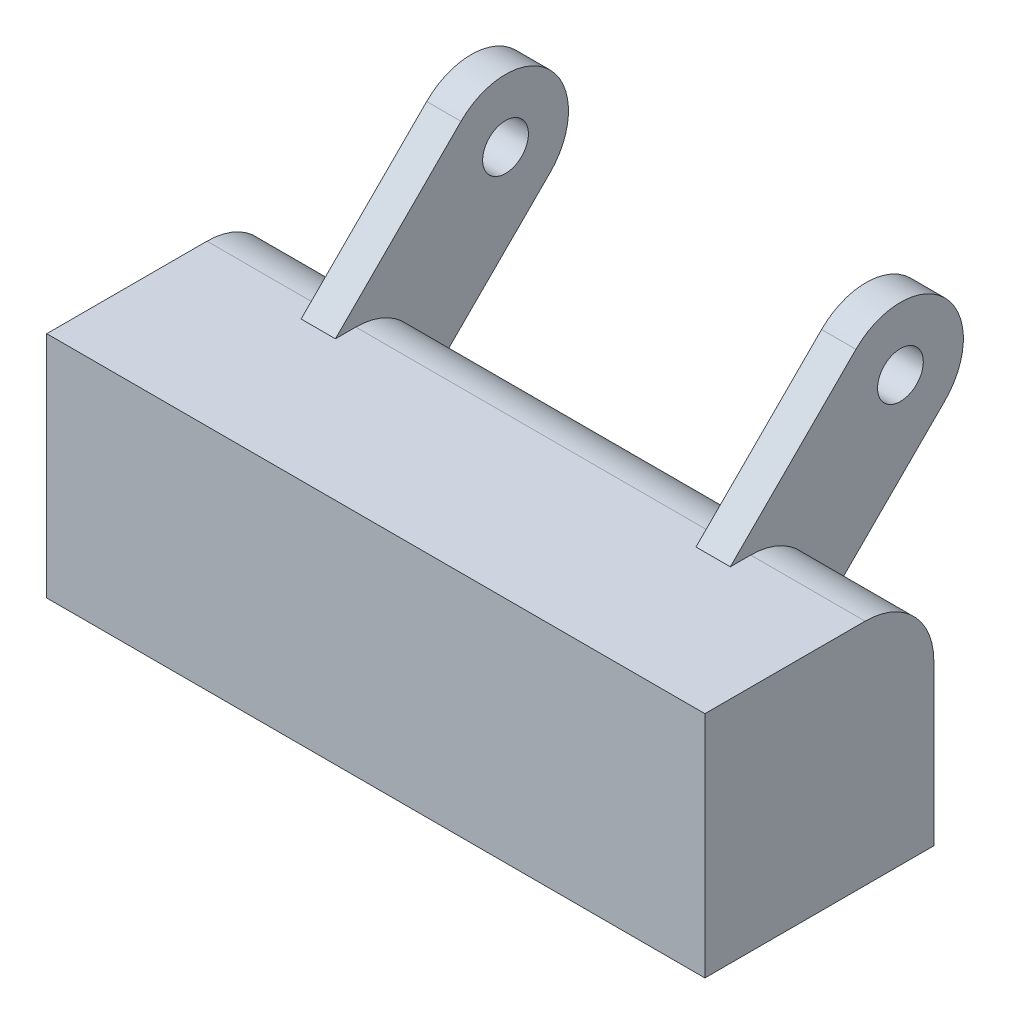
ISO-10303-21;
HEADER;
FILE_DESCRIPTION(('STEP AP214'),'2;1');
FILE_NAME('part.step','',(''),(''),'','','');
FILE_SCHEMA(('AUTOMOTIVE_DESIGN { 1 0 10303 214 1 1 1 1 }'));
ENDSEC;
DATA;
#1=APPLICATION_CONTEXT('core data for automotive mechanical design processes');
#2=APPLICATION_PROTOCOL_DEFINITION('international standard','automotive_design',2000,#1);
#3=PRODUCT_CONTEXT('',#1,'mechanical');
#4=PRODUCT('Part','Part','',(#3));
#5=PRODUCT_RELATED_PRODUCT_CATEGORY('part','',(#4));
#6=PRODUCT_DEFINITION_FORMATION('','',#4);
#7=PRODUCT_DEFINITION_CONTEXT('part definition',#1,'design');
#8=PRODUCT_DEFINITION('design','',#6,#7);
#9=PRODUCT_DEFINITION_SHAPE('','',#8);
#10=(LENGTH_UNIT() NAMED_UNIT(*) SI_UNIT(.MILLI.,.METRE.));
#11=(NAMED_UNIT(*) PLANE_ANGLE_UNIT() SI_UNIT($,.RADIAN.));
#12=(NAMED_UNIT(*) SI_UNIT($,.STERADIAN.) SOLID_ANGLE_UNIT());
#13=UNCERTAINTY_MEASURE_WITH_UNIT(LENGTH_MEASURE(1.E-05),#10,'distance_accuracy_value','');
#14=(GEOMETRIC_REPRESENTATION_CONTEXT(3) GLOBAL_UNCERTAINTY_ASSIGNED_CONTEXT((#13)) GLOBAL_UNIT_ASSIGNED_CONTEXT((#10,
#11,#12)) REPRESENTATION_CONTEXT('',''));
#15=CARTESIAN_POINT('',(0.,0.,0.));
#16=DIRECTION('',(0.,0.,1.));
#17=DIRECTION('',(1.,0.,0.));
#18=AXIS2_PLACEMENT_3D('',#15,#16,#17);
#19=CARTESIAN_POINT('',(28.75,-6.,6.));
#20=DIRECTION('',(-1.,0.,0.));
#21=DIRECTION('',(0.,0.,1.));
#22=AXIS2_PLACEMENT_3D('',#19,#20,#21);
#23=CYLINDRICAL_SURFACE('',#22,6.);
#24=CARTESIAN_POINT('',(-18.75,-6.,6.));
#25=DIRECTION('',(1.,0.,0.));
#26=DIRECTION('',(0.,0.,-1.));
#27=AXIS2_PLACEMENT_3D('',#24,#25,#26);
#28=CIRCLE('',#27,6.);
#29=CARTESIAN_POINT('',(-18.75,-6.00000000000004,0.));
#30=VERTEX_POINT('',#29);
#31=CARTESIAN_POINT('',(-18.75,0.,6.00000000000004));
#32=VERTEX_POINT('',#31);
#33=EDGE_CURVE('E164',#30,#32,#28,.T.);
#34=ORIENTED_EDGE('',*,*,#33,.F.);
#35=DIRECTION('',(-1.,0.,0.));
#36=VECTOR('',#35,1.);
#37=CARTESIAN_POINT('',(28.75,-6.00000000000004,0.));
#38=LINE('',#37,#36);
#39=CARTESIAN_POINT('',(-28.75,-6.00000000000004,0.));
#40=VERTEX_POINT('',#39);
#41=EDGE_CURVE('E269',#30,#40,#38,.T.);
#42=ORIENTED_EDGE('',*,*,#41,.T.);
#43=CARTESIAN_POINT('',(-28.75,-6.,6.));
#44=DIRECTION('',(1.,0.,0.));
#45=DIRECTION('',(0.,0.,-1.));
#46=AXIS2_PLACEMENT_3D('',#43,#44,#45);
#47=CIRCLE('',#46,6.);
#48=CARTESIAN_POINT('',(-28.75,0.,6.00000000000004));
#49=VERTEX_POINT('',#48);
#50=EDGE_CURVE('E259',#40,#49,#47,.T.);
#51=ORIENTED_EDGE('',*,*,#50,.T.);
#52=DIRECTION('',(-1.,0.,0.));
#53=VECTOR('',#52,1.);
#54=CARTESIAN_POINT('',(28.75,0.,6.00000000000004));
#55=LINE('',#54,#53);
#56=EDGE_CURVE('E265',#32,#49,#55,.T.);
#57=ORIENTED_EDGE('',*,*,#56,.F.);
#58=EDGE_LOOP('',(#34,#42,#51,#57));
#59=FACE_BOUND('',#58,.T.);
#60=ADVANCED_FACE('F39',(#59),#23,.T.);
#61=CARTESIAN_POINT('',(28.75,-6.00000000000004,0.));
#62=DIRECTION('',(0.,0.,1.));
#63=DIRECTION('',(0.,-1.,0.));
#64=AXIS2_PLACEMENT_3D('',#61,#62,#63);
#65=PLANE('',#64);
#66=DIRECTION('',(1.,0.,0.));
#67=VECTOR('',#66,1.);
#68=CARTESIAN_POINT('',(28.75,-7.77817459305203,0.));
#69=LINE('',#68,#67);
#70=CARTESIAN_POINT('',(-18.75,-7.77817459305203,0.));
#71=VERTEX_POINT('',#70);
#72=CARTESIAN_POINT('',(-15.75,-7.77817459305203,0.));
#73=VERTEX_POINT('',#72);
#74=EDGE_CURVE('E11',#71,#73,#69,.T.);
#75=ORIENTED_EDGE('',*,*,#74,.T.);
#76=DIRECTION('',(0.,1.,0.));
#77=VECTOR('',#76,1.);
#78=CARTESIAN_POINT('',(-15.75,-6.00000000000004,0.));
#79=LINE('',#78,#77);
#80=CARTESIAN_POINT('',(-15.75,-6.00000000000004,0.));
#81=VERTEX_POINT('',#80);
#82=EDGE_CURVE('E178',#73,#81,#79,.T.);
#83=ORIENTED_EDGE('',*,*,#82,.T.);
#84=CARTESIAN_POINT('',(15.75,-6.,0.));
#85=VERTEX_POINT('',#84);
#86=EDGE_CURVE('E275',#85,#81,#38,.T.);
#87=ORIENTED_EDGE('',*,*,#86,.F.);
#88=DIRECTION('',(0.,1.,0.));
#89=VECTOR('',#88,1.);
#90=CARTESIAN_POINT('',(15.75,-6.00000000000004,0.));
#91=LINE('',#90,#89);
#92=CARTESIAN_POINT('',(15.75,-7.77817459305203,0.));
#93=VERTEX_POINT('',#92);
#94=EDGE_CURVE('E236',#93,#85,#91,.T.);
#95=ORIENTED_EDGE('',*,*,#94,.F.);
#96=DIRECTION('',(-1.,0.,0.));
#97=VECTOR('',#96,1.);
#98=CARTESIAN_POINT('',(28.75,-7.77817459305203,0.));
#99=LINE('',#98,#97);
#100=CARTESIAN_POINT('',(18.75,-7.77817459305203,0.));
#101=VERTEX_POINT('',#100);
#102=EDGE_CURVE('E289',#101,#93,#99,.T.);
#103=ORIENTED_EDGE('',*,*,#102,.F.);
#104=DIRECTION('',(0.,1.,0.));
#105=VECTOR('',#104,1.);
#106=CARTESIAN_POINT('',(18.75,-6.00000000000004,0.));
#107=LINE('',#106,#105);
#108=CARTESIAN_POINT('',(18.75,-6.,0.));
#109=VERTEX_POINT('',#108);
#110=EDGE_CURVE('E231',#101,#109,#107,.T.);
#111=ORIENTED_EDGE('',*,*,#110,.T.);
#112=CARTESIAN_POINT('',(28.75,-6.00000000000004,0.));
#113=VERTEX_POINT('',#112);
#114=EDGE_CURVE('E271',#113,#109,#38,.T.);
#115=ORIENTED_EDGE('',*,*,#114,.F.);
#116=DIRECTION('',(0.,1.,0.));
#117=VECTOR('',#116,1.);
#118=CARTESIAN_POINT('',(28.75,-6.00000000000004,0.));
#119=LINE('',#118,#117);
#120=CARTESIAN_POINT('',(28.75,-20.,0.));
#121=VERTEX_POINT('',#120);
#122=EDGE_CURVE('E245',#121,#113,#119,.T.);
#123=ORIENTED_EDGE('',*,*,#122,.F.);
#124=DIRECTION('',(-1.,0.,0.));
#125=VECTOR('',#124,1.);
#126=CARTESIAN_POINT('',(28.75,-20.,0.));
#127=LINE('',#126,#125);
#128=CARTESIAN_POINT('',(-28.75,-20.,0.));
#129=VERTEX_POINT('',#128);
#130=EDGE_CURVE('E274',#121,#129,#127,.T.);
#131=ORIENTED_EDGE('',*,*,#130,.T.);
#132=DIRECTION('',(0.,1.,0.));
#133=VECTOR('',#132,1.);
#134=CARTESIAN_POINT('',(-28.75,-6.00000000000004,0.));
#135=LINE('',#134,#133);
#136=EDGE_CURVE('E256',#129,#40,#135,.T.);
#137=ORIENTED_EDGE('',*,*,#136,.T.);
#138=ORIENTED_EDGE('',*,*,#41,.F.);
#139=DIRECTION('',(0.,1.,0.));
#140=VECTOR('',#139,1.);
#141=CARTESIAN_POINT('',(-18.75,-6.00000000000004,0.));
#142=LINE('',#141,#140);
#143=EDGE_CURVE('E57',#71,#30,#142,.T.);
#144=ORIENTED_EDGE('',*,*,#143,.F.);
#145=EDGE_LOOP('',(#75,#83,#87,#95,#103,#111,#115,#123,#131,#137,#138,#144));
#146=FACE_BOUND('',#145,.T.);
#147=ADVANCED_FACE('F332',(#146),#65,.F.);
#148=ORIENTED_EDGE('',*,*,#86,.T.);
#149=CARTESIAN_POINT('',(-15.75,-6.,6.));
#150=DIRECTION('',(1.,0.,0.));
#151=DIRECTION('',(0.,0.,-1.));
#152=AXIS2_PLACEMENT_3D('',#149,#150,#151);
#153=CIRCLE('',#152,6.);
#154=CARTESIAN_POINT('',(-15.75,0.,6.00000000000004));
#155=VERTEX_POINT('',#154);
#156=EDGE_CURVE('E198',#81,#155,#153,.T.);
#157=ORIENTED_EDGE('',*,*,#156,.T.);
#158=CARTESIAN_POINT('',(15.75,0.,6.00000000000004));
#159=VERTEX_POINT('',#158);
#160=EDGE_CURVE('E270',#159,#155,#55,.T.);
#161=ORIENTED_EDGE('',*,*,#160,.F.);
#162=CARTESIAN_POINT('',(15.75,-6.,6.));
#163=DIRECTION('',(1.,0.,0.));
#164=DIRECTION('',(0.,0.,-1.));
#165=AXIS2_PLACEMENT_3D('',#162,#163,#164);
#166=CIRCLE('',#165,6.);
#167=EDGE_CURVE('E234',#85,#159,#166,.T.);
#168=ORIENTED_EDGE('',*,*,#167,.F.);
#169=EDGE_LOOP('',(#148,#157,#161,#168));
#170=FACE_BOUND('',#169,.T.);
#171=ADVANCED_FACE('F353',(#170),#23,.T.);
#172=CARTESIAN_POINT('',(28.75,0.,6.00000000000004));
#173=DIRECTION('',(0.,-1.,0.));
#174=DIRECTION('',(0.,0.,-1.));
#175=AXIS2_PLACEMENT_3D('',#172,#173,#174);
#176=PLANE('',#175);
#177=ORIENTED_EDGE('',*,*,#160,.T.);
#178=DIRECTION('',(0.,0.,1.));
#179=VECTOR('',#178,1.);
#180=CARTESIAN_POINT('',(-15.75,0.,6.00000000000004));
#181=LINE('',#180,#179);
#182=CARTESIAN_POINT('',(-15.75,0.,7.77817459305202));
#183=VERTEX_POINT('',#182);
#184=EDGE_CURVE('E47',#155,#183,#181,.T.);
#185=ORIENTED_EDGE('',*,*,#184,.T.);
#186=DIRECTION('',(1.,0.,0.));
#187=VECTOR('',#186,1.);
#188=CARTESIAN_POINT('',(28.75,0.,7.77817459305202));
#189=LINE('',#188,#187);
#190=CARTESIAN_POINT('',(-18.75,0.,7.77817459305202));
#191=VERTEX_POINT('',#190);
#192=EDGE_CURVE('E294',#191,#183,#189,.T.);
#193=ORIENTED_EDGE('',*,*,#192,.F.);
#194=DIRECTION('',(0.,0.,1.));
#195=VECTOR('',#194,1.);
#196=CARTESIAN_POINT('',(-18.75,0.,6.00000000000004));
#197=LINE('',#196,#195);
#198=EDGE_CURVE('E291',#32,#191,#197,.T.);
#199=ORIENTED_EDGE('',*,*,#198,.F.);
#200=ORIENTED_EDGE('',*,*,#56,.T.);
#201=DIRECTION('',(0.,0.,1.));
#202=VECTOR('',#201,1.);
#203=CARTESIAN_POINT('',(-28.75,0.,6.00000000000004));
#204=LINE('',#203,#202);
#205=CARTESIAN_POINT('',(-28.75,0.,20.));
#206=VERTEX_POINT('',#205);
#207=EDGE_CURVE('E243',#49,#206,#204,.T.);
#208=ORIENTED_EDGE('',*,*,#207,.T.);
#209=DIRECTION('',(-1.,0.,0.));
#210=VECTOR('',#209,1.);
#211=CARTESIAN_POINT('',(28.75,0.,20.));
#212=LINE('',#211,#210);
#213=CARTESIAN_POINT('',(28.75,0.,20.));
#214=VERTEX_POINT('',#213);
#215=EDGE_CURVE('E251',#214,#206,#212,.T.);
#216=ORIENTED_EDGE('',*,*,#215,.F.);
#217=DIRECTION('',(0.,0.,1.));
#218=VECTOR('',#217,1.);
#219=CARTESIAN_POINT('',(28.75,0.,6.00000000000004));
#220=LINE('',#219,#218);
#221=CARTESIAN_POINT('',(28.75,0.,6.00000000000004));
#222=VERTEX_POINT('',#221);
#223=EDGE_CURVE('E249',#222,#214,#220,.T.);
#224=ORIENTED_EDGE('',*,*,#223,.F.);
#225=CARTESIAN_POINT('',(18.75,0.,6.00000000000004));
#226=VERTEX_POINT('',#225);
#227=EDGE_CURVE('E266',#222,#226,#55,.T.);
#228=ORIENTED_EDGE('',*,*,#227,.T.);
#229=DIRECTION('',(0.,0.,1.));
#230=VECTOR('',#229,1.);
#231=CARTESIAN_POINT('',(18.75,0.,6.00000000000004));
#232=LINE('',#231,#230);
#233=CARTESIAN_POINT('',(18.75,0.,7.77817459305202));
#234=VERTEX_POINT('',#233);
#235=EDGE_CURVE('E281',#226,#234,#232,.T.);
#236=ORIENTED_EDGE('',*,*,#235,.T.);
#237=DIRECTION('',(-1.,0.,0.));
#238=VECTOR('',#237,1.);
#239=CARTESIAN_POINT('',(28.75,0.,7.77817459305202));
#240=LINE('',#239,#238);
#241=CARTESIAN_POINT('',(15.75,0.,7.77817459305202));
#242=VERTEX_POINT('',#241);
#243=EDGE_CURVE('E284',#234,#242,#240,.T.);
#244=ORIENTED_EDGE('',*,*,#243,.T.);
#245=DIRECTION('',(0.,0.,1.));
#246=VECTOR('',#245,1.);
#247=CARTESIAN_POINT('',(15.75,0.,6.00000000000004));
#248=LINE('',#247,#246);
#249=EDGE_CURVE('E287',#159,#242,#248,.T.);
#250=ORIENTED_EDGE('',*,*,#249,.F.);
#251=EDGE_LOOP('',(#177,#185,#193,#199,#200,#208,#216,#224,#228,#236,#244,#250));
#252=FACE_BOUND('',#251,.T.);
#253=ADVANCED_FACE('F299',(#252),#176,.F.);
#254=CARTESIAN_POINT('',(28.75,0.,20.));
#255=DIRECTION('',(0.,0.,-1.));
#256=DIRECTION('',(0.,1.,0.));
#257=AXIS2_PLACEMENT_3D('',#254,#255,#256);
#258=PLANE('',#257);
#259=DIRECTION('',(0.,-1.,0.));
#260=VECTOR('',#259,1.);
#261=CARTESIAN_POINT('',(-28.75,0.,20.));
#262=LINE('',#261,#260);
#263=CARTESIAN_POINT('',(-28.75,-20.,20.));
#264=VERTEX_POINT('',#263);
#265=EDGE_CURVE('E238',#206,#264,#262,.T.);
#266=ORIENTED_EDGE('',*,*,#265,.T.);
#267=DIRECTION('',(-1.,0.,0.));
#268=VECTOR('',#267,1.);
#269=CARTESIAN_POINT('',(28.75,-20.,20.));
#270=LINE('',#269,#268);
#271=CARTESIAN_POINT('',(28.75,-20.,20.));
#272=VERTEX_POINT('',#271);
#273=EDGE_CURVE('E278',#272,#264,#270,.T.);
#274=ORIENTED_EDGE('',*,*,#273,.F.);
#275=DIRECTION('',(0.,-1.,0.));
#276=VECTOR('',#275,1.);
#277=CARTESIAN_POINT('',(28.75,0.,20.));
#278=LINE('',#277,#276);
#279=EDGE_CURVE('E239',#214,#272,#278,.T.);
#280=ORIENTED_EDGE('',*,*,#279,.F.);
#281=ORIENTED_EDGE('',*,*,#215,.T.);
#282=EDGE_LOOP('',(#266,#274,#280,#281));
#283=FACE_BOUND('',#282,.T.);
#284=ADVANCED_FACE('F41',(#283),#258,.F.);
#285=CARTESIAN_POINT('',(28.75,-20.,0.));
#286=DIRECTION('',(0.,1.,0.));
#287=DIRECTION('',(0.,0.,1.));
#288=AXIS2_PLACEMENT_3D('',#285,#286,#287);
#289=PLANE('',#288);
#290=DIRECTION('',(0.,0.,-1.));
#291=VECTOR('',#290,1.);
#292=CARTESIAN_POINT('',(-28.75,-20.,0.));
#293=LINE('',#292,#291);
#294=EDGE_CURVE('E254',#264,#129,#293,.T.);
#295=ORIENTED_EDGE('',*,*,#294,.T.);
#296=ORIENTED_EDGE('',*,*,#130,.F.);
#297=DIRECTION('',(0.,0.,-1.));
#298=VECTOR('',#297,1.);
#299=CARTESIAN_POINT('',(28.75,-20.,0.));
#300=LINE('',#299,#298);
#301=EDGE_CURVE('E242',#272,#121,#300,.T.);
#302=ORIENTED_EDGE('',*,*,#301,.F.);
#303=ORIENTED_EDGE('',*,*,#273,.T.);
#304=EDGE_LOOP('',(#295,#296,#302,#303));
#305=FACE_BOUND('',#304,.T.);
#306=ADVANCED_FACE('F363',(#305),#289,.F.);
#307=ORIENTED_EDGE('',*,*,#114,.T.);
#308=CARTESIAN_POINT('',(18.75,-6.,6.));
#309=DIRECTION('',(1.,0.,0.));
#310=DIRECTION('',(0.,0.,-1.));
#311=AXIS2_PLACEMENT_3D('',#308,#309,#310);
#312=CIRCLE('',#311,6.);
#313=EDGE_CURVE('E227',#109,#226,#312,.T.);
#314=ORIENTED_EDGE('',*,*,#313,.T.);
#315=ORIENTED_EDGE('',*,*,#227,.F.);
#316=CARTESIAN_POINT('',(28.75,-6.,6.));
#317=DIRECTION('',(1.,0.,0.));
#318=DIRECTION('',(0.,0.,-1.));
#319=AXIS2_PLACEMENT_3D('',#316,#317,#318);
#320=CIRCLE('',#319,6.);
#321=EDGE_CURVE('E247',#113,#222,#320,.T.);
#322=ORIENTED_EDGE('',*,*,#321,.F.);
#323=EDGE_LOOP('',(#307,#314,#315,#322));
#324=FACE_BOUND('',#323,.T.);
#325=ADVANCED_FACE('F326',(#324),#23,.T.);
#326=CARTESIAN_POINT('',(28.75,-6.,6.));
#327=DIRECTION('',(1.,0.,0.));
#328=DIRECTION('',(0.,0.,-1.));
#329=AXIS2_PLACEMENT_3D('',#326,#327,#328);
#330=PLANE('',#329);
#331=ORIENTED_EDGE('',*,*,#279,.T.);
#332=ORIENTED_EDGE('',*,*,#301,.T.);
#333=ORIENTED_EDGE('',*,*,#122,.T.);
#334=ORIENTED_EDGE('',*,*,#321,.T.);
#335=ORIENTED_EDGE('',*,*,#223,.T.);
#336=EDGE_LOOP('',(#331,#332,#333,#334,#335));
#337=FACE_BOUND('',#336,.T.);
#338=ADVANCED_FACE('F321',(#337),#330,.T.);
#339=CARTESIAN_POINT('',(-28.75,-6.,6.));
#340=DIRECTION('',(1.,0.,0.));
#341=DIRECTION('',(0.,0.,-1.));
#342=AXIS2_PLACEMENT_3D('',#339,#340,#341);
#343=PLANE('',#342);
#344=ORIENTED_EDGE('',*,*,#265,.F.);
#345=ORIENTED_EDGE('',*,*,#207,.F.);
#346=ORIENTED_EDGE('',*,*,#50,.F.);
#347=ORIENTED_EDGE('',*,*,#136,.F.);
#348=ORIENTED_EDGE('',*,*,#294,.F.);
#349=EDGE_LOOP('',(#344,#345,#346,#347,#348));
#350=FACE_BOUND('',#349,.T.);
#351=ADVANCED_FACE('F314',(#350),#343,.F.);
#352=CARTESIAN_POINT('',(15.75,-3.88908729652601,-3.88908729652601));
#353=DIRECTION('',(0.,0.707106781186547,0.707106781186548));
#354=DIRECTION('',(0.,-0.707106781186548,0.707106781186547));
#355=AXIS2_PLACEMENT_3D('',#352,#353,#354);
#356=PLANE('',#355);
#357=DIRECTION('',(0.,-0.707106781186548,0.707106781186547));
#358=VECTOR('',#357,1.);
#359=CARTESIAN_POINT('',(18.75,-3.88908729652601,-3.88908729652601));
#360=LINE('',#359,#358);
#361=CARTESIAN_POINT('',(18.75,3.19238815542511,-10.9705627484771));
#362=VERTEX_POINT('',#361);
#363=EDGE_CURVE('E201',#362,#101,#360,.T.);
#364=ORIENTED_EDGE('',*,*,#363,.T.);
#365=ORIENTED_EDGE('',*,*,#102,.T.);
#366=DIRECTION('',(0.,-0.707106781186548,0.707106781186547));
#367=VECTOR('',#366,1.);
#368=CARTESIAN_POINT('',(15.75,-3.88908729652601,-3.88908729652601));
#369=LINE('',#368,#367);
#370=CARTESIAN_POINT('',(15.75,3.19238815542511,-10.9705627484771));
#371=VERTEX_POINT('',#370);
#372=EDGE_CURVE('E202',#371,#93,#369,.T.);
#373=ORIENTED_EDGE('',*,*,#372,.F.);
#374=DIRECTION('',(1.,0.,0.));
#375=VECTOR('',#374,1.);
#376=CARTESIAN_POINT('',(15.75,3.19238815542511,-10.9705627484771));
#377=LINE('',#376,#375);
#378=EDGE_CURVE('E215',#371,#362,#377,.T.);
#379=ORIENTED_EDGE('',*,*,#378,.T.);
#380=EDGE_LOOP('',(#364,#365,#373,#379));
#381=FACE_BOUND('',#380,.T.);
#382=ADVANCED_FACE('F338',(#381),#356,.F.);
#383=CARTESIAN_POINT('',(15.75,3.88908729652601,3.88908729652601));
#384=DIRECTION('',(0.,0.707106781186547,0.707106781186548));
#385=DIRECTION('',(0.,-0.707106781186548,0.707106781186547));
#386=AXIS2_PLACEMENT_3D('',#383,#384,#385);
#387=PLANE('',#386);
#388=ORIENTED_EDGE('',*,*,#243,.F.);
#389=DIRECTION('',(0.,-0.707106781186548,0.707106781186547));
#390=VECTOR('',#389,1.);
#391=CARTESIAN_POINT('',(18.75,3.88908729652601,3.88908729652601));
#392=LINE('',#391,#390);
#393=CARTESIAN_POINT('',(18.75,10.9705627484771,-3.19238815542512));
#394=VERTEX_POINT('',#393);
#395=EDGE_CURVE('E221',#394,#234,#392,.T.);
#396=ORIENTED_EDGE('',*,*,#395,.F.);
#397=DIRECTION('',(1.,0.,0.));
#398=VECTOR('',#397,1.);
#399=CARTESIAN_POINT('',(15.75,10.9705627484771,-3.19238815542512));
#400=LINE('',#399,#398);
#401=CARTESIAN_POINT('',(15.75,10.9705627484771,-3.19238815542512));
#402=VERTEX_POINT('',#401);
#403=EDGE_CURVE('E225',#402,#394,#400,.T.);
#404=ORIENTED_EDGE('',*,*,#403,.F.);
#405=DIRECTION('',(0.,-0.707106781186548,0.707106781186547));
#406=VECTOR('',#405,1.);
#407=CARTESIAN_POINT('',(15.75,3.88908729652601,3.88908729652601));
#408=LINE('',#407,#406);
#409=EDGE_CURVE('E209',#402,#242,#408,.T.);
#410=ORIENTED_EDGE('',*,*,#409,.T.);
#411=EDGE_LOOP('',(#388,#396,#404,#410));
#412=FACE_BOUND('',#411,.T.);
#413=ADVANCED_FACE('F350',(#412),#387,.T.);
#414=CARTESIAN_POINT('',(15.75,0.,0.));
#415=DIRECTION('',(1.,0.,0.));
#416=DIRECTION('',(0.,0.,-1.));
#417=AXIS2_PLACEMENT_3D('',#414,#415,#416);
#418=PLANE('',#417);
#419=CARTESIAN_POINT('',(15.75,7.08147545195112,-7.08147545195113));
#420=DIRECTION('',(1.,0.,0.));
#421=DIRECTION('',(0.,0.,-1.));
#422=AXIS2_PLACEMENT_3D('',#419,#420,#421);
#423=CIRCLE('',#422,2.);
#424=CARTESIAN_POINT('',(15.75,7.08147545195112,-9.08147545195113));
#425=VERTEX_POINT('',#424);
#426=EDGE_CURVE('E212',#425,#425,#423,.T.);
#427=ORIENTED_EDGE('',*,*,#426,.T.);
#428=EDGE_LOOP('',(#427));
#429=FACE_BOUND('',#428,.T.);
#430=ORIENTED_EDGE('',*,*,#372,.T.);
#431=ORIENTED_EDGE('',*,*,#94,.T.);
#432=ORIENTED_EDGE('',*,*,#167,.T.);
#433=ORIENTED_EDGE('',*,*,#249,.T.);
#434=ORIENTED_EDGE('',*,*,#409,.F.);
#435=CARTESIAN_POINT('',(15.75,7.08147545195112,-7.08147545195113));
#436=DIRECTION('',(1.,0.,0.));
#437=DIRECTION('',(0.,0.,-1.));
#438=AXIS2_PLACEMENT_3D('',#435,#436,#437);
#439=CIRCLE('',#438,5.5);
#440=EDGE_CURVE('E205',#371,#402,#439,.T.);
#441=ORIENTED_EDGE('',*,*,#440,.F.);
#442=EDGE_LOOP('',(#430,#431,#432,#433,#434,#441));
#443=FACE_BOUND('',#442,.T.);
#444=ADVANCED_FACE('F341',(#429,#443),#418,.F.);
#445=CARTESIAN_POINT('',(18.75,0.,0.));
#446=DIRECTION('',(1.,0.,0.));
#447=DIRECTION('',(0.,0.,-1.));
#448=AXIS2_PLACEMENT_3D('',#445,#446,#447);
#449=PLANE('',#448);
#450=CARTESIAN_POINT('',(18.75,7.08147545195112,-7.08147545195113));
#451=DIRECTION('',(1.,0.,0.));
#452=DIRECTION('',(0.,0.,-1.));
#453=AXIS2_PLACEMENT_3D('',#450,#451,#452);
#454=CIRCLE('',#453,2.);
#455=CARTESIAN_POINT('',(18.75,7.08147545195112,-9.08147545195113));
#456=VERTEX_POINT('',#455);
#457=EDGE_CURVE('E206',#456,#456,#454,.T.);
#458=ORIENTED_EDGE('',*,*,#457,.F.);
#459=EDGE_LOOP('',(#458));
#460=FACE_BOUND('',#459,.T.);
#461=ORIENTED_EDGE('',*,*,#110,.F.);
#462=ORIENTED_EDGE('',*,*,#363,.F.);
#463=CARTESIAN_POINT('',(18.75,7.08147545195112,-7.08147545195113));
#464=DIRECTION('',(1.,0.,0.));
#465=DIRECTION('',(0.,0.,-1.));
#466=AXIS2_PLACEMENT_3D('',#463,#464,#465);
#467=CIRCLE('',#466,5.5);
#468=EDGE_CURVE('E218',#362,#394,#467,.T.);
#469=ORIENTED_EDGE('',*,*,#468,.T.);
#470=ORIENTED_EDGE('',*,*,#395,.T.);
#471=ORIENTED_EDGE('',*,*,#235,.F.);
#472=ORIENTED_EDGE('',*,*,#313,.F.);
#473=EDGE_LOOP('',(#461,#462,#469,#470,#471,#472));
#474=FACE_BOUND('',#473,.T.);
#475=ADVANCED_FACE('F329',(#460,#474),#449,.T.);
#476=CARTESIAN_POINT('',(15.75,7.08147545195112,-7.08147545195113));
#477=DIRECTION('',(1.,0.,0.));
#478=DIRECTION('',(0.,0.,-1.));
#479=AXIS2_PLACEMENT_3D('',#476,#477,#478);
#480=CYLINDRICAL_SURFACE('',#479,5.5);
#481=ORIENTED_EDGE('',*,*,#468,.F.);
#482=ORIENTED_EDGE('',*,*,#378,.F.);
#483=ORIENTED_EDGE('',*,*,#440,.T.);
#484=ORIENTED_EDGE('',*,*,#403,.T.);
#485=EDGE_LOOP('',(#481,#482,#483,#484));
#486=FACE_BOUND('',#485,.T.);
#487=ADVANCED_FACE('F346',(#486),#480,.T.);
#488=CARTESIAN_POINT('',(15.75,7.08147545195112,-7.08147545195113));
#489=DIRECTION('',(1.,0.,0.));
#490=DIRECTION('',(0.,0.,-1.));
#491=AXIS2_PLACEMENT_3D('',#488,#489,#490);
#492=CYLINDRICAL_SURFACE('',#491,2.);
#493=ORIENTED_EDGE('',*,*,#426,.F.);
#494=EDGE_LOOP('',(#493));
#495=FACE_BOUND('',#494,.T.);
#496=ORIENTED_EDGE('',*,*,#457,.T.);
#497=EDGE_LOOP('',(#496));
#498=FACE_BOUND('',#497,.T.);
#499=ADVANCED_FACE('F394',(#495,#498),#492,.F.);
#500=CARTESIAN_POINT('',(-15.75,-3.88908729652601,-3.88908729652601));
#501=DIRECTION('',(0.,-0.707106781186547,-0.707106781186548));
#502=DIRECTION('',(0.,0.707106781186548,-0.707106781186547));
#503=AXIS2_PLACEMENT_3D('',#500,#501,#502);
#504=PLANE('',#503);
#505=ORIENTED_EDGE('',*,*,#74,.F.);
#506=DIRECTION('',(0.,-0.707106781186548,0.707106781186547));
#507=VECTOR('',#506,1.);
#508=CARTESIAN_POINT('',(-18.75,-3.88908729652601,-3.88908729652601));
#509=LINE('',#508,#507);
#510=CARTESIAN_POINT('',(-18.75,3.19238815542511,-10.9705627484771));
#511=VERTEX_POINT('',#510);
#512=EDGE_CURVE('E161',#511,#71,#509,.T.);
#513=ORIENTED_EDGE('',*,*,#512,.F.);
#514=DIRECTION('',(-1.,0.,0.));
#515=VECTOR('',#514,1.);
#516=CARTESIAN_POINT('',(-15.75,3.19238815542511,-10.9705627484771));
#517=LINE('',#516,#515);
#518=CARTESIAN_POINT('',(-15.75,3.19238815542511,-10.9705627484771));
#519=VERTEX_POINT('',#518);
#520=EDGE_CURVE('E155',#519,#511,#517,.T.);
#521=ORIENTED_EDGE('',*,*,#520,.F.);
#522=DIRECTION('',(0.,-0.707106781186548,0.707106781186547));
#523=VECTOR('',#522,1.);
#524=CARTESIAN_POINT('',(-15.75,-3.88908729652601,-3.88908729652601));
#525=LINE('',#524,#523);
#526=EDGE_CURVE('E159',#519,#73,#525,.T.);
#527=ORIENTED_EDGE('',*,*,#526,.T.);
#528=EDGE_LOOP('',(#505,#513,#521,#527));
#529=FACE_BOUND('',#528,.T.);
#530=ADVANCED_FACE('F157',(#529),#504,.T.);
#531=CARTESIAN_POINT('',(-15.75,3.88908729652601,3.88908729652601));
#532=DIRECTION('',(0.,-0.707106781186547,-0.707106781186548));
#533=DIRECTION('',(0.,0.707106781186548,-0.707106781186547));
#534=AXIS2_PLACEMENT_3D('',#531,#532,#533);
#535=PLANE('',#534);
#536=DIRECTION('',(0.,-0.707106781186548,0.707106781186547));
#537=VECTOR('',#536,1.);
#538=CARTESIAN_POINT('',(-18.75,3.88908729652601,3.88908729652601));
#539=LINE('',#538,#537);
#540=CARTESIAN_POINT('',(-18.75,10.9705627484771,-3.19238815542512));
#541=VERTEX_POINT('',#540);
#542=EDGE_CURVE('E182',#541,#191,#539,.T.);
#543=ORIENTED_EDGE('',*,*,#542,.T.);
#544=ORIENTED_EDGE('',*,*,#192,.T.);
#545=DIRECTION('',(0.,-0.707106781186548,0.707106781186547));
#546=VECTOR('',#545,1.);
#547=CARTESIAN_POINT('',(-15.75,3.88908729652601,3.88908729652601));
#548=LINE('',#547,#546);
#549=CARTESIAN_POINT('',(-15.75,10.9705627484771,-3.19238815542512));
#550=VERTEX_POINT('',#549);
#551=EDGE_CURVE('E174',#550,#183,#548,.T.);
#552=ORIENTED_EDGE('',*,*,#551,.F.);
#553=DIRECTION('',(-1.,0.,0.));
#554=VECTOR('',#553,1.);
#555=CARTESIAN_POINT('',(-15.75,10.9705627484771,-3.19238815542512));
#556=LINE('',#555,#554);
#557=EDGE_CURVE('E165',#550,#541,#556,.T.);
#558=ORIENTED_EDGE('',*,*,#557,.T.);
#559=EDGE_LOOP('',(#543,#544,#552,#558));
#560=FACE_BOUND('',#559,.T.);
#561=ADVANCED_FACE('F303',(#560),#535,.F.);
#562=CARTESIAN_POINT('',(-15.75,0.,0.));
#563=DIRECTION('',(1.,0.,0.));
#564=DIRECTION('',(0.,0.,-1.));
#565=AXIS2_PLACEMENT_3D('',#562,#563,#564);
#566=PLANE('',#565);
#567=CARTESIAN_POINT('',(-15.75,7.08147545195112,-7.08147545195113));
#568=DIRECTION('',(1.,0.,0.));
#569=DIRECTION('',(0.,0.,-1.));
#570=AXIS2_PLACEMENT_3D('',#567,#568,#569);
#571=CIRCLE('',#570,2.);
#572=CARTESIAN_POINT('',(-15.75,7.08147545195112,-9.08147545195113));
#573=VERTEX_POINT('',#572);
#574=EDGE_CURVE('E186',#573,#573,#571,.T.);
#575=ORIENTED_EDGE('',*,*,#574,.F.);
#576=EDGE_LOOP('',(#575));
#577=FACE_BOUND('',#576,.T.);
#578=ORIENTED_EDGE('',*,*,#82,.F.);
#579=ORIENTED_EDGE('',*,*,#526,.F.);
#580=CARTESIAN_POINT('',(-15.75,7.08147545195112,-7.08147545195113));
#581=DIRECTION('',(1.,0.,0.));
#582=DIRECTION('',(0.,0.,-1.));
#583=AXIS2_PLACEMENT_3D('',#580,#581,#582);
#584=CIRCLE('',#583,5.5);
#585=EDGE_CURVE('E168',#519,#550,#584,.T.);
#586=ORIENTED_EDGE('',*,*,#585,.T.);
#587=ORIENTED_EDGE('',*,*,#551,.T.);
#588=ORIENTED_EDGE('',*,*,#184,.F.);
#589=ORIENTED_EDGE('',*,*,#156,.F.);
#590=EDGE_LOOP('',(#578,#579,#586,#587,#588,#589));
#591=FACE_BOUND('',#590,.T.);
#592=ADVANCED_FACE('F176',(#577,#591),#566,.T.);
#593=CARTESIAN_POINT('',(-18.75,0.,0.));
#594=DIRECTION('',(1.,0.,0.));
#595=DIRECTION('',(0.,0.,-1.));
#596=AXIS2_PLACEMENT_3D('',#593,#594,#595);
#597=PLANE('',#596);
#598=CARTESIAN_POINT('',(-18.75,7.08147545195112,-7.08147545195113));
#599=DIRECTION('',(1.,0.,0.));
#600=DIRECTION('',(0.,0.,-1.));
#601=AXIS2_PLACEMENT_3D('',#598,#599,#600);
#602=CIRCLE('',#601,2.);
#603=CARTESIAN_POINT('',(-18.75,7.08147545195112,-9.08147545195113));
#604=VERTEX_POINT('',#603);
#605=EDGE_CURVE('E179',#604,#604,#602,.T.);
#606=ORIENTED_EDGE('',*,*,#605,.T.);
#607=EDGE_LOOP('',(#606));
#608=FACE_BOUND('',#607,.T.);
#609=ORIENTED_EDGE('',*,*,#512,.T.);
#610=ORIENTED_EDGE('',*,*,#143,.T.);
#611=ORIENTED_EDGE('',*,*,#33,.T.);
#612=ORIENTED_EDGE('',*,*,#198,.T.);
#613=ORIENTED_EDGE('',*,*,#542,.F.);
#614=CARTESIAN_POINT('',(-18.75,7.08147545195112,-7.08147545195113));
#615=DIRECTION('',(1.,0.,0.));
#616=DIRECTION('',(0.,0.,-1.));
#617=AXIS2_PLACEMENT_3D('',#614,#615,#616);
#618=CIRCLE('',#617,5.5);
#619=EDGE_CURVE('E190',#511,#541,#618,.T.);
#620=ORIENTED_EDGE('',*,*,#619,.F.);
#621=EDGE_LOOP('',(#609,#610,#611,#612,#613,#620));
#622=FACE_BOUND('',#621,.T.);
#623=ADVANCED_FACE('F306',(#608,#622),#597,.F.);
#624=CARTESIAN_POINT('',(-15.75,7.08147545195112,-7.08147545195113));
#625=DIRECTION('',(-1.,0.,0.));
#626=DIRECTION('',(0.,0.,1.));
#627=AXIS2_PLACEMENT_3D('',#624,#625,#626);
#628=CYLINDRICAL_SURFACE('',#627,5.5);
#629=ORIENTED_EDGE('',*,*,#619,.T.);
#630=ORIENTED_EDGE('',*,*,#557,.F.);
#631=ORIENTED_EDGE('',*,*,#585,.F.);
#632=ORIENTED_EDGE('',*,*,#520,.T.);
#633=EDGE_LOOP('',(#629,#630,#631,#632));
#634=FACE_BOUND('',#633,.T.);
#635=ADVANCED_FACE('F169',(#634),#628,.T.);
#636=CARTESIAN_POINT('',(-15.75,7.08147545195112,-7.08147545195113));
#637=DIRECTION('',(-1.,0.,0.));
#638=DIRECTION('',(0.,0.,1.));
#639=AXIS2_PLACEMENT_3D('',#636,#637,#638);
#640=CYLINDRICAL_SURFACE('',#639,2.);
#641=ORIENTED_EDGE('',*,*,#574,.T.);
#642=EDGE_LOOP('',(#641));
#643=FACE_BOUND('',#642,.T.);
#644=ORIENTED_EDGE('',*,*,#605,.F.);
#645=EDGE_LOOP('',(#644));
#646=FACE_BOUND('',#645,.T.);
#647=ADVANCED_FACE('F434',(#643,#646),#640,.F.);
#648=CLOSED_SHELL('',(#60,#147,#171,#253,#284,#306,#325,#338,#351,#382,#413,#444,#475,#487,#499,
#530,#561,#592,#623,#635,#647));
#649=MANIFOLD_SOLID_BREP('B2',#648);
#650=ADVANCED_BREP_SHAPE_REPRESENTATION('',(#18,#649),#14);
#651=SHAPE_DEFINITION_REPRESENTATION(#9,#650);
ENDSEC;
END-ISO-10303-21;
